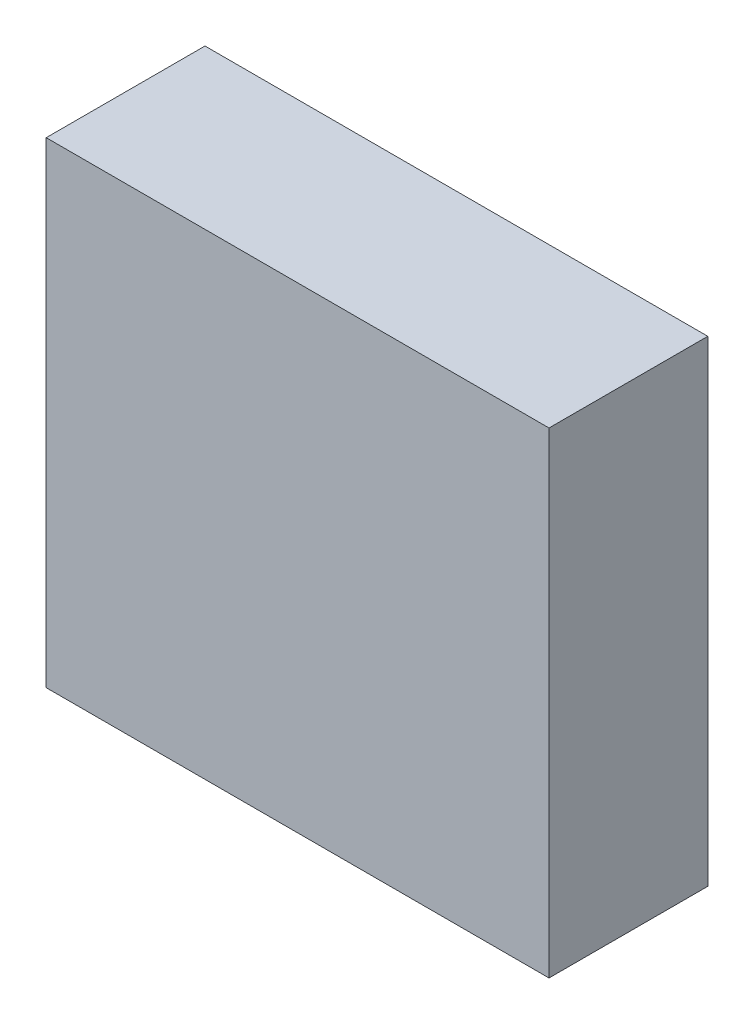
ISO-10303-21;
HEADER;
FILE_DESCRIPTION(('STEP AP214'),'2;1');
FILE_NAME('part.step','',(''),(''),'','','');
FILE_SCHEMA(('AUTOMOTIVE_DESIGN { 1 0 10303 214 1 1 1 1 }'));
ENDSEC;
DATA;
#1=APPLICATION_CONTEXT('core data for automotive mechanical design processes');
#2=APPLICATION_PROTOCOL_DEFINITION('international standard','automotive_design',2000,#1);
#3=PRODUCT_CONTEXT('',#1,'mechanical');
#4=PRODUCT('Part','Part','',(#3));
#5=PRODUCT_RELATED_PRODUCT_CATEGORY('part','',(#4));
#6=PRODUCT_DEFINITION_FORMATION('','',#4);
#7=PRODUCT_DEFINITION_CONTEXT('part definition',#1,'design');
#8=PRODUCT_DEFINITION('design','',#6,#7);
#9=PRODUCT_DEFINITION_SHAPE('','',#8);
#10=(LENGTH_UNIT() NAMED_UNIT(*) SI_UNIT(.MILLI.,.METRE.));
#11=(NAMED_UNIT(*) PLANE_ANGLE_UNIT() SI_UNIT($,.RADIAN.));
#12=(NAMED_UNIT(*) SI_UNIT($,.STERADIAN.) SOLID_ANGLE_UNIT());
#13=UNCERTAINTY_MEASURE_WITH_UNIT(LENGTH_MEASURE(1.E-05),#10,'distance_accuracy_value','');
#14=(GEOMETRIC_REPRESENTATION_CONTEXT(3) GLOBAL_UNCERTAINTY_ASSIGNED_CONTEXT((#13)) GLOBAL_UNIT_ASSIGNED_CONTEXT((#10,
#11,#12)) REPRESENTATION_CONTEXT('',''));
#15=CARTESIAN_POINT('',(0.,0.,0.));
#16=DIRECTION('',(0.,0.,1.));
#17=DIRECTION('',(1.,0.,0.));
#18=AXIS2_PLACEMENT_3D('',#15,#16,#17);
#19=CARTESIAN_POINT('',(47.5,45.,30.));
#20=DIRECTION('',(-1.,0.,0.));
#21=DIRECTION('',(0.,-1.,0.));
#22=AXIS2_PLACEMENT_3D('',#19,#20,#21);
#23=PLANE('',#22);
#24=DIRECTION('',(0.,1.,0.));
#25=VECTOR('',#24,1.);
#26=CARTESIAN_POINT('',(47.5,45.,0.));
#27=LINE('',#26,#25);
#28=CARTESIAN_POINT('',(47.5,-45.,0.));
#29=VERTEX_POINT('',#28);
#30=CARTESIAN_POINT('',(47.5,45.,0.));
#31=VERTEX_POINT('',#30);
#32=EDGE_CURVE('E96',#29,#31,#27,.T.);
#33=ORIENTED_EDGE('',*,*,#32,.T.);
#34=DIRECTION('',(0.,0.,-1.));
#35=VECTOR('',#34,1.);
#36=CARTESIAN_POINT('',(47.5,45.,30.));
#37=LINE('',#36,#35);
#38=CARTESIAN_POINT('',(47.5,45.,30.));
#39=VERTEX_POINT('',#38);
#40=EDGE_CURVE('E11',#39,#31,#37,.T.);
#41=ORIENTED_EDGE('',*,*,#40,.F.);
#42=DIRECTION('',(0.,1.,0.));
#43=VECTOR('',#42,1.);
#44=CARTESIAN_POINT('',(47.5,45.,30.));
#45=LINE('',#44,#43);
#46=CARTESIAN_POINT('',(47.5,-45.,30.));
#47=VERTEX_POINT('',#46);
#48=EDGE_CURVE('E84',#47,#39,#45,.T.);
#49=ORIENTED_EDGE('',*,*,#48,.F.);
#50=DIRECTION('',(0.,0.,-1.));
#51=VECTOR('',#50,1.);
#52=CARTESIAN_POINT('',(47.5,-45.,30.));
#53=LINE('',#52,#51);
#54=EDGE_CURVE('E92',#47,#29,#53,.T.);
#55=ORIENTED_EDGE('',*,*,#54,.T.);
#56=EDGE_LOOP('',(#33,#41,#49,#55));
#57=FACE_BOUND('',#56,.T.);
#58=ADVANCED_FACE('F33',(#57),#23,.F.);
#59=CARTESIAN_POINT('',(-47.5,45.,30.));
#60=DIRECTION('',(0.,-1.,0.));
#61=DIRECTION('',(0.,0.,-1.));
#62=AXIS2_PLACEMENT_3D('',#59,#60,#61);
#63=PLANE('',#62);
#64=DIRECTION('',(-1.,0.,0.));
#65=VECTOR('',#64,1.);
#66=CARTESIAN_POINT('',(-47.5,45.,0.));
#67=LINE('',#66,#65);
#68=CARTESIAN_POINT('',(-47.5,45.,0.));
#69=VERTEX_POINT('',#68);
#70=EDGE_CURVE('E88',#31,#69,#67,.T.);
#71=ORIENTED_EDGE('',*,*,#70,.T.);
#72=DIRECTION('',(0.,0.,-1.));
#73=VECTOR('',#72,1.);
#74=CARTESIAN_POINT('',(-47.5,45.,30.));
#75=LINE('',#74,#73);
#76=CARTESIAN_POINT('',(-47.5,45.,30.));
#77=VERTEX_POINT('',#76);
#78=EDGE_CURVE('E41',#77,#69,#75,.T.);
#79=ORIENTED_EDGE('',*,*,#78,.F.);
#80=DIRECTION('',(-1.,0.,0.));
#81=VECTOR('',#80,1.);
#82=CARTESIAN_POINT('',(-47.5,45.,30.));
#83=LINE('',#82,#81);
#84=EDGE_CURVE('E79',#39,#77,#83,.T.);
#85=ORIENTED_EDGE('',*,*,#84,.F.);
#86=ORIENTED_EDGE('',*,*,#40,.T.);
#87=EDGE_LOOP('',(#71,#79,#85,#86));
#88=FACE_BOUND('',#87,.T.);
#89=ADVANCED_FACE('F87',(#88),#63,.F.);
#90=CARTESIAN_POINT('',(-47.5,45.,30.));
#91=DIRECTION('',(1.,0.,0.));
#92=DIRECTION('',(0.,1.,0.));
#93=AXIS2_PLACEMENT_3D('',#90,#91,#92);
#94=PLANE('',#93);
#95=DIRECTION('',(0.,-1.,0.));
#96=VECTOR('',#95,1.);
#97=CARTESIAN_POINT('',(-47.5,45.,0.));
#98=LINE('',#97,#96);
#99=CARTESIAN_POINT('',(-47.5,-45.,0.));
#100=VERTEX_POINT('',#99);
#101=EDGE_CURVE('E66',#69,#100,#98,.T.);
#102=ORIENTED_EDGE('',*,*,#101,.T.);
#103=DIRECTION('',(0.,0.,-1.));
#104=VECTOR('',#103,1.);
#105=CARTESIAN_POINT('',(-47.5,-45.,30.));
#106=LINE('',#105,#104);
#107=CARTESIAN_POINT('',(-47.5,-45.,30.));
#108=VERTEX_POINT('',#107);
#109=EDGE_CURVE('E89',#108,#100,#106,.T.);
#110=ORIENTED_EDGE('',*,*,#109,.F.);
#111=DIRECTION('',(0.,-1.,0.));
#112=VECTOR('',#111,1.);
#113=CARTESIAN_POINT('',(-47.5,45.,30.));
#114=LINE('',#113,#112);
#115=EDGE_CURVE('E82',#77,#108,#114,.T.);
#116=ORIENTED_EDGE('',*,*,#115,.F.);
#117=ORIENTED_EDGE('',*,*,#78,.T.);
#118=EDGE_LOOP('',(#102,#110,#116,#117));
#119=FACE_BOUND('',#118,.T.);
#120=ADVANCED_FACE('F90',(#119),#94,.F.);
#121=CARTESIAN_POINT('',(-47.5,-45.,30.));
#122=DIRECTION('',(0.,1.,0.));
#123=DIRECTION('',(0.,0.,1.));
#124=AXIS2_PLACEMENT_3D('',#121,#122,#123);
#125=PLANE('',#124);
#126=DIRECTION('',(1.,0.,0.));
#127=VECTOR('',#126,1.);
#128=CARTESIAN_POINT('',(-47.5,-45.,0.));
#129=LINE('',#128,#127);
#130=EDGE_CURVE('E72',#100,#29,#129,.T.);
#131=ORIENTED_EDGE('',*,*,#130,.T.);
#132=ORIENTED_EDGE('',*,*,#54,.F.);
#133=DIRECTION('',(1.,0.,0.));
#134=VECTOR('',#133,1.);
#135=CARTESIAN_POINT('',(-47.5,-45.,30.));
#136=LINE('',#135,#134);
#137=EDGE_CURVE('E49',#108,#47,#136,.T.);
#138=ORIENTED_EDGE('',*,*,#137,.F.);
#139=ORIENTED_EDGE('',*,*,#109,.T.);
#140=EDGE_LOOP('',(#131,#132,#138,#139));
#141=FACE_BOUND('',#140,.T.);
#142=ADVANCED_FACE('F103',(#141),#125,.F.);
#143=CARTESIAN_POINT('',(0.,0.,30.));
#144=DIRECTION('',(0.,0.,1.));
#145=DIRECTION('',(1.,0.,0.));
#146=AXIS2_PLACEMENT_3D('',#143,#144,#145);
#147=PLANE('',#146);
#148=ORIENTED_EDGE('',*,*,#48,.T.);
#149=ORIENTED_EDGE('',*,*,#84,.T.);
#150=ORIENTED_EDGE('',*,*,#115,.T.);
#151=ORIENTED_EDGE('',*,*,#137,.T.);
#152=EDGE_LOOP('',(#148,#149,#150,#151));
#153=FACE_BOUND('',#152,.T.);
#154=ADVANCED_FACE('F80',(#153),#147,.T.);
#155=CARTESIAN_POINT('',(0.,0.,0.));
#156=DIRECTION('',(0.,0.,1.));
#157=DIRECTION('',(1.,0.,0.));
#158=AXIS2_PLACEMENT_3D('',#155,#156,#157);
#159=PLANE('',#158);
#160=ORIENTED_EDGE('',*,*,#32,.F.);
#161=ORIENTED_EDGE('',*,*,#130,.F.);
#162=ORIENTED_EDGE('',*,*,#101,.F.);
#163=ORIENTED_EDGE('',*,*,#70,.F.);
#164=EDGE_LOOP('',(#160,#161,#162,#163));
#165=FACE_BOUND('',#164,.T.);
#166=ADVANCED_FACE('F106',(#165),#159,.F.);
#167=CLOSED_SHELL('',(#58,#89,#120,#142,#154,#166));
#168=MANIFOLD_SOLID_BREP('B2',#167);
#169=ADVANCED_BREP_SHAPE_REPRESENTATION('',(#18,#168),#14);
#170=SHAPE_DEFINITION_REPRESENTATION(#9,#169);
ENDSEC;
END-ISO-10303-21;
